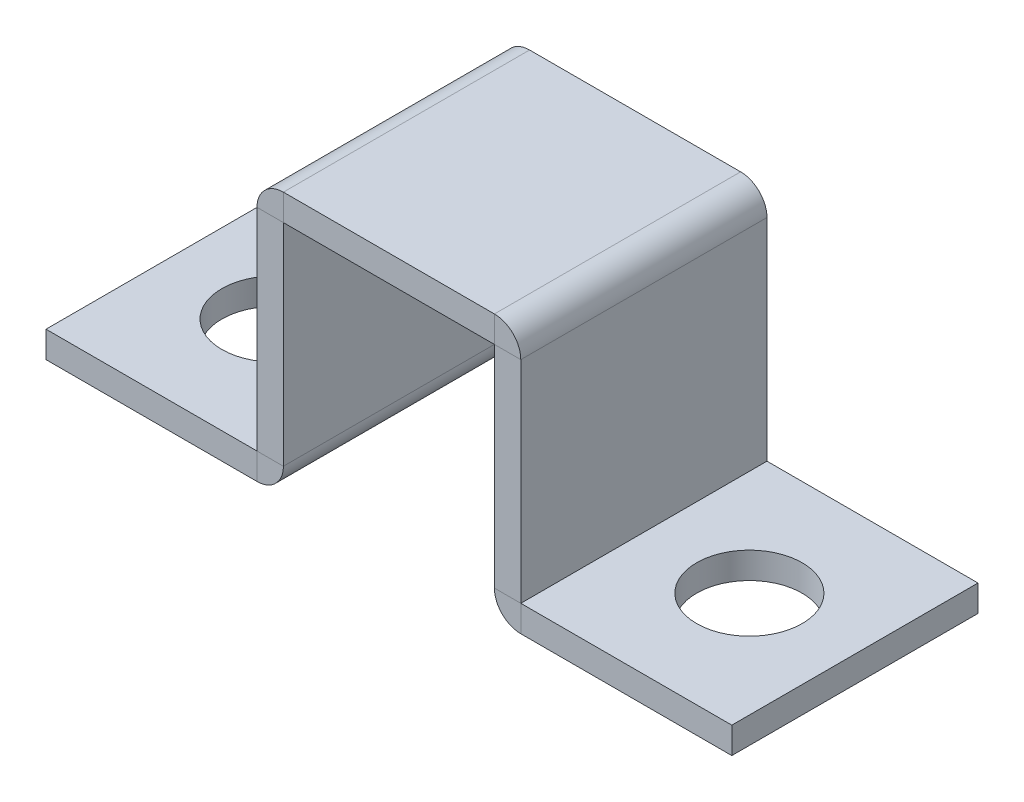
ISO-10303-21;
HEADER;
FILE_DESCRIPTION(('STEP AP214'),'2;1');
FILE_NAME('part.step','',(''),(''),'','','');
FILE_SCHEMA(('AUTOMOTIVE_DESIGN { 1 0 10303 214 1 1 1 1 }'));
ENDSEC;
DATA;
#1=APPLICATION_CONTEXT('core data for automotive mechanical design processes');
#2=APPLICATION_PROTOCOL_DEFINITION('international standard','automotive_design',2000,#1);
#3=PRODUCT_CONTEXT('',#1,'mechanical');
#4=PRODUCT('Part','Part','',(#3));
#5=PRODUCT_RELATED_PRODUCT_CATEGORY('part','',(#4));
#6=PRODUCT_DEFINITION_FORMATION('','',#4);
#7=PRODUCT_DEFINITION_CONTEXT('part definition',#1,'design');
#8=PRODUCT_DEFINITION('design','',#6,#7);
#9=PRODUCT_DEFINITION_SHAPE('','',#8);
#10=(LENGTH_UNIT() NAMED_UNIT(*) SI_UNIT(.MILLI.,.METRE.));
#11=(NAMED_UNIT(*) PLANE_ANGLE_UNIT() SI_UNIT($,.RADIAN.));
#12=(NAMED_UNIT(*) SI_UNIT($,.STERADIAN.) SOLID_ANGLE_UNIT());
#13=UNCERTAINTY_MEASURE_WITH_UNIT(LENGTH_MEASURE(1.E-05),#10,'distance_accuracy_value','');
#14=(GEOMETRIC_REPRESENTATION_CONTEXT(3) GLOBAL_UNCERTAINTY_ASSIGNED_CONTEXT((#13)) GLOBAL_UNIT_ASSIGNED_CONTEXT((#10,
#11,#12)) REPRESENTATION_CONTEXT('',''));
#15=CARTESIAN_POINT('',(0.,0.,0.));
#16=DIRECTION('',(0.,0.,1.));
#17=DIRECTION('',(1.,0.,0.));
#18=AXIS2_PLACEMENT_3D('',#15,#16,#17);
#19=CARTESIAN_POINT('',(7.49999999999999,0.,-7.));
#20=DIRECTION('',(0.,0.,-1.));
#21=DIRECTION('',(-1.,0.,0.));
#22=AXIS2_PLACEMENT_3D('',#19,#20,#21);
#23=PLANE('',#22);
#24=DIRECTION('',(0.,-1.,0.));
#25=VECTOR('',#24,1.);
#26=CARTESIAN_POINT('',(7.49999999999999,0.,-7.));
#27=LINE('',#26,#25);
#28=CARTESIAN_POINT('',(7.49999999999999,0.,-7.));
#29=VERTEX_POINT('',#28);
#30=CARTESIAN_POINT('',(7.49999999999999,-1.5,-7.));
#31=VERTEX_POINT('',#30);
#32=EDGE_CURVE('E11',#29,#31,#27,.T.);
#33=ORIENTED_EDGE('',*,*,#32,.F.);
#34=DIRECTION('',(1.,0.,0.));
#35=VECTOR('',#34,1.);
#36=CARTESIAN_POINT('',(7.49999999999999,0.,-7.));
#37=LINE('',#36,#35);
#38=CARTESIAN_POINT('',(19.5,0.,-7.));
#39=VERTEX_POINT('',#38);
#40=EDGE_CURVE('E211',#29,#39,#37,.T.);
#41=ORIENTED_EDGE('',*,*,#40,.T.);
#42=DIRECTION('',(0.,-1.,0.));
#43=VECTOR('',#42,1.);
#44=CARTESIAN_POINT('',(19.5,0.,-7.));
#45=LINE('',#44,#43);
#46=CARTESIAN_POINT('',(19.5,-1.5,-7.));
#47=VERTEX_POINT('',#46);
#48=EDGE_CURVE('E209',#39,#47,#45,.T.);
#49=ORIENTED_EDGE('',*,*,#48,.T.);
#50=DIRECTION('',(1.,0.,0.));
#51=VECTOR('',#50,1.);
#52=CARTESIAN_POINT('',(7.49999999999999,-1.5,-7.));
#53=LINE('',#52,#51);
#54=EDGE_CURVE('E161',#31,#47,#53,.T.);
#55=ORIENTED_EDGE('',*,*,#54,.F.);
#56=EDGE_LOOP('',(#33,#41,#49,#55));
#57=FACE_BOUND('',#56,.T.);
#58=ADVANCED_FACE('F35',(#57),#23,.T.);
#59=CARTESIAN_POINT('',(7.49999999999999,0.,-7.));
#60=DIRECTION('',(0.,0.,-1.));
#61=DIRECTION('',(-1.,0.,0.));
#62=AXIS2_PLACEMENT_3D('',#59,#60,#61);
#63=PLANE('',#62);
#64=DIRECTION('',(-1.,0.,0.));
#65=VECTOR('',#64,1.);
#66=CARTESIAN_POINT('',(7.49999999999999,0.,-7.));
#67=LINE('',#66,#65);
#68=CARTESIAN_POINT('',(5.99999999999999,0.,-7.));
#69=VERTEX_POINT('',#68);
#70=EDGE_CURVE('E43',#29,#69,#67,.T.);
#71=ORIENTED_EDGE('',*,*,#70,.F.);
#72=ORIENTED_EDGE('',*,*,#32,.T.);
#73=CARTESIAN_POINT('',(7.49999999999999,0.,-7.));
#74=DIRECTION('',(0.,0.,1.));
#75=DIRECTION('',(1.,0.,0.));
#76=AXIS2_PLACEMENT_3D('',#73,#74,#75);
#77=CIRCLE('',#76,1.5);
#78=EDGE_CURVE('E276',#31,#69,#77,.F.);
#79=ORIENTED_EDGE('',*,*,#78,.T.);
#80=EDGE_LOOP('',(#71,#72,#79));
#81=FACE_BOUND('',#80,.T.);
#82=ADVANCED_FACE('F327',(#81),#63,.T.);
#83=CARTESIAN_POINT('',(7.49999999999999,0.,7.));
#84=DIRECTION('',(0.,0.,1.));
#85=DIRECTION('',(1.,0.,0.));
#86=AXIS2_PLACEMENT_3D('',#83,#84,#85);
#87=PLANE('',#86);
#88=DIRECTION('',(-1.,0.,0.));
#89=VECTOR('',#88,1.);
#90=CARTESIAN_POINT('',(7.49999999999999,0.,7.));
#91=LINE('',#90,#89);
#92=CARTESIAN_POINT('',(7.49999999999999,0.,7.));
#93=VERTEX_POINT('',#92);
#94=CARTESIAN_POINT('',(5.99999999999999,0.,7.));
#95=VERTEX_POINT('',#94);
#96=EDGE_CURVE('E50',#93,#95,#91,.T.);
#97=ORIENTED_EDGE('',*,*,#96,.F.);
#98=DIRECTION('',(0.,-1.,0.));
#99=VECTOR('',#98,1.);
#100=CARTESIAN_POINT('',(7.5,13.5,7.));
#101=LINE('',#100,#99);
#102=CARTESIAN_POINT('',(7.5,12.,7.));
#103=VERTEX_POINT('',#102);
#104=EDGE_CURVE('E171',#103,#93,#101,.T.);
#105=ORIENTED_EDGE('',*,*,#104,.F.);
#106=DIRECTION('',(1.,0.,0.));
#107=VECTOR('',#106,1.);
#108=CARTESIAN_POINT('',(6.,12.,7.));
#109=LINE('',#108,#107);
#110=CARTESIAN_POINT('',(6.,12.,7.));
#111=VERTEX_POINT('',#110);
#112=EDGE_CURVE('E308',#111,#103,#109,.T.);
#113=ORIENTED_EDGE('',*,*,#112,.F.);
#114=DIRECTION('',(0.,-1.,0.));
#115=VECTOR('',#114,1.);
#116=CARTESIAN_POINT('',(6.,13.5,7.));
#117=LINE('',#116,#115);
#118=EDGE_CURVE('E204',#111,#95,#117,.T.);
#119=ORIENTED_EDGE('',*,*,#118,.T.);
#120=EDGE_LOOP('',(#97,#105,#113,#119));
#121=FACE_BOUND('',#120,.T.);
#122=ADVANCED_FACE('F346',(#121),#87,.T.);
#123=CARTESIAN_POINT('',(7.49999999999999,0.,7.));
#124=DIRECTION('',(0.,0.,1.));
#125=DIRECTION('',(1.,0.,0.));
#126=AXIS2_PLACEMENT_3D('',#123,#124,#125);
#127=PLANE('',#126);
#128=DIRECTION('',(0.,-1.,0.));
#129=VECTOR('',#128,1.);
#130=CARTESIAN_POINT('',(7.49999999999999,0.,7.));
#131=LINE('',#130,#129);
#132=CARTESIAN_POINT('',(7.49999999999999,-1.5,7.));
#133=VERTEX_POINT('',#132);
#134=EDGE_CURVE('E57',#93,#133,#131,.T.);
#135=ORIENTED_EDGE('',*,*,#134,.F.);
#136=ORIENTED_EDGE('',*,*,#96,.T.);
#137=CARTESIAN_POINT('',(7.49999999999999,0.,7.));
#138=DIRECTION('',(0.,0.,1.));
#139=DIRECTION('',(1.,0.,0.));
#140=AXIS2_PLACEMENT_3D('',#137,#138,#139);
#141=CIRCLE('',#140,1.5);
#142=EDGE_CURVE('E285',#95,#133,#141,.T.);
#143=ORIENTED_EDGE('',*,*,#142,.T.);
#144=EDGE_LOOP('',(#135,#136,#143));
#145=FACE_BOUND('',#144,.T.);
#146=ADVANCED_FACE('F336',(#145),#127,.T.);
#147=CARTESIAN_POINT('',(-6.,12.,7.));
#148=DIRECTION('',(0.,0.,1.));
#149=DIRECTION('',(1.,0.,0.));
#150=AXIS2_PLACEMENT_3D('',#147,#148,#149);
#151=PLANE('',#150);
#152=DIRECTION('',(0.,1.,0.));
#153=VECTOR('',#152,1.);
#154=CARTESIAN_POINT('',(-6.,12.,7.));
#155=LINE('',#154,#153);
#156=CARTESIAN_POINT('',(-6.,12.,7.));
#157=VERTEX_POINT('',#156);
#158=CARTESIAN_POINT('',(-6.,13.5,7.));
#159=VERTEX_POINT('',#158);
#160=EDGE_CURVE('E316',#157,#159,#155,.T.);
#161=ORIENTED_EDGE('',*,*,#160,.F.);
#162=DIRECTION('',(1.,0.,0.));
#163=VECTOR('',#162,1.);
#164=CARTESIAN_POINT('',(-7.5,12.,7.));
#165=LINE('',#164,#163);
#166=EDGE_CURVE('E201',#157,#111,#165,.T.);
#167=ORIENTED_EDGE('',*,*,#166,.T.);
#168=DIRECTION('',(0.,1.,0.));
#169=VECTOR('',#168,1.);
#170=CARTESIAN_POINT('',(6.,12.,7.));
#171=LINE('',#170,#169);
#172=CARTESIAN_POINT('',(6.,13.5,7.));
#173=VERTEX_POINT('',#172);
#174=EDGE_CURVE('E306',#111,#173,#171,.T.);
#175=ORIENTED_EDGE('',*,*,#174,.T.);
#176=DIRECTION('',(1.,0.,0.));
#177=VECTOR('',#176,1.);
#178=CARTESIAN_POINT('',(-7.5,13.5,7.));
#179=LINE('',#178,#177);
#180=EDGE_CURVE('E180',#159,#173,#179,.T.);
#181=ORIENTED_EDGE('',*,*,#180,.F.);
#182=EDGE_LOOP('',(#161,#167,#175,#181));
#183=FACE_BOUND('',#182,.T.);
#184=ADVANCED_FACE('F361',(#183),#151,.T.);
#185=CARTESIAN_POINT('',(-6.,12.,7.));
#186=DIRECTION('',(0.,0.,1.));
#187=DIRECTION('',(1.,0.,0.));
#188=AXIS2_PLACEMENT_3D('',#185,#186,#187);
#189=PLANE('',#188);
#190=DIRECTION('',(-1.,0.,0.));
#191=VECTOR('',#190,1.);
#192=CARTESIAN_POINT('',(-6.,12.,7.));
#193=LINE('',#192,#191);
#194=CARTESIAN_POINT('',(-7.5,12.,7.));
#195=VERTEX_POINT('',#194);
#196=EDGE_CURVE('E314',#157,#195,#193,.T.);
#197=ORIENTED_EDGE('',*,*,#196,.F.);
#198=ORIENTED_EDGE('',*,*,#160,.T.);
#199=CARTESIAN_POINT('',(-6.,12.,7.));
#200=DIRECTION('',(0.,0.,1.));
#201=DIRECTION('',(1.,0.,0.));
#202=AXIS2_PLACEMENT_3D('',#199,#200,#201);
#203=CIRCLE('',#202,1.5);
#204=EDGE_CURVE('E183',#195,#159,#203,.F.);
#205=ORIENTED_EDGE('',*,*,#204,.F.);
#206=EDGE_LOOP('',(#197,#198,#205));
#207=FACE_BOUND('',#206,.T.);
#208=ADVANCED_FACE('F369',(#207),#189,.T.);
#209=CARTESIAN_POINT('',(-6.,12.,-7.));
#210=DIRECTION('',(0.,0.,-1.));
#211=DIRECTION('',(-1.,0.,0.));
#212=AXIS2_PLACEMENT_3D('',#209,#210,#211);
#213=PLANE('',#212);
#214=DIRECTION('',(-1.,0.,0.));
#215=VECTOR('',#214,1.);
#216=CARTESIAN_POINT('',(-6.,12.,-7.));
#217=LINE('',#216,#215);
#218=CARTESIAN_POINT('',(-6.,12.,-7.));
#219=VERTEX_POINT('',#218);
#220=CARTESIAN_POINT('',(-7.5,12.,-7.));
#221=VERTEX_POINT('',#220);
#222=EDGE_CURVE('E312',#219,#221,#217,.T.);
#223=ORIENTED_EDGE('',*,*,#222,.F.);
#224=DIRECTION('',(0.,1.,0.));
#225=VECTOR('',#224,1.);
#226=CARTESIAN_POINT('',(-6.00000000000001,0.,-7.));
#227=LINE('',#226,#225);
#228=CARTESIAN_POINT('',(-6.00000000000001,0.,-7.));
#229=VERTEX_POINT('',#228);
#230=EDGE_CURVE('E238',#229,#219,#227,.T.);
#231=ORIENTED_EDGE('',*,*,#230,.F.);
#232=DIRECTION('',(1.,0.,0.));
#233=VECTOR('',#232,1.);
#234=CARTESIAN_POINT('',(-7.50000000000001,0.,-7.));
#235=LINE('',#234,#233);
#236=CARTESIAN_POINT('',(-7.50000000000001,0.,-7.));
#237=VERTEX_POINT('',#236);
#238=EDGE_CURVE('E300',#237,#229,#235,.T.);
#239=ORIENTED_EDGE('',*,*,#238,.F.);
#240=DIRECTION('',(0.,1.,0.));
#241=VECTOR('',#240,1.);
#242=CARTESIAN_POINT('',(-7.50000000000001,0.,-7.));
#243=LINE('',#242,#241);
#244=EDGE_CURVE('E226',#237,#221,#243,.T.);
#245=ORIENTED_EDGE('',*,*,#244,.T.);
#246=EDGE_LOOP('',(#223,#231,#239,#245));
#247=FACE_BOUND('',#246,.T.);
#248=ADVANCED_FACE('F440',(#247),#213,.T.);
#249=CARTESIAN_POINT('',(-6.,12.,-7.));
#250=DIRECTION('',(0.,0.,-1.));
#251=DIRECTION('',(-1.,0.,0.));
#252=AXIS2_PLACEMENT_3D('',#249,#250,#251);
#253=PLANE('',#252);
#254=DIRECTION('',(0.,1.,0.));
#255=VECTOR('',#254,1.);
#256=CARTESIAN_POINT('',(-6.,12.,-7.));
#257=LINE('',#256,#255);
#258=CARTESIAN_POINT('',(-6.,13.5,-7.));
#259=VERTEX_POINT('',#258);
#260=EDGE_CURVE('E310',#219,#259,#257,.T.);
#261=ORIENTED_EDGE('',*,*,#260,.F.);
#262=ORIENTED_EDGE('',*,*,#222,.T.);
#263=CARTESIAN_POINT('',(-6.,12.,-7.));
#264=DIRECTION('',(0.,0.,1.));
#265=DIRECTION('',(1.,0.,0.));
#266=AXIS2_PLACEMENT_3D('',#263,#264,#265);
#267=CIRCLE('',#266,1.5);
#268=EDGE_CURVE('E223',#221,#259,#267,.F.);
#269=ORIENTED_EDGE('',*,*,#268,.T.);
#270=EDGE_LOOP('',(#261,#262,#269));
#271=FACE_BOUND('',#270,.T.);
#272=ADVANCED_FACE('F443',(#271),#253,.T.);
#273=CARTESIAN_POINT('',(6.,12.,7.));
#274=DIRECTION('',(0.,0.,1.));
#275=DIRECTION('',(1.,0.,0.));
#276=AXIS2_PLACEMENT_3D('',#273,#274,#275);
#277=PLANE('',#276);
#278=DIRECTION('',(1.,0.,0.));
#279=VECTOR('',#278,1.);
#280=CARTESIAN_POINT('',(7.49999999999999,0.,7.));
#281=LINE('',#280,#279);
#282=CARTESIAN_POINT('',(19.5,0.,7.));
#283=VERTEX_POINT('',#282);
#284=EDGE_CURVE('E169',#93,#283,#281,.T.);
#285=ORIENTED_EDGE('',*,*,#284,.F.);
#286=ORIENTED_EDGE('',*,*,#134,.T.);
#287=DIRECTION('',(1.,0.,0.));
#288=VECTOR('',#287,1.);
#289=CARTESIAN_POINT('',(7.49999999999999,-1.5,7.));
#290=LINE('',#289,#288);
#291=CARTESIAN_POINT('',(19.5,-1.5,7.));
#292=VERTEX_POINT('',#291);
#293=EDGE_CURVE('E146',#133,#292,#290,.T.);
#294=ORIENTED_EDGE('',*,*,#293,.T.);
#295=DIRECTION('',(0.,-1.,0.));
#296=VECTOR('',#295,1.);
#297=CARTESIAN_POINT('',(19.5,0.,7.));
#298=LINE('',#297,#296);
#299=EDGE_CURVE('E150',#283,#292,#298,.T.);
#300=ORIENTED_EDGE('',*,*,#299,.F.);
#301=EDGE_LOOP('',(#285,#286,#294,#300));
#302=FACE_BOUND('',#301,.T.);
#303=ADVANCED_FACE('F148',(#302),#277,.T.);
#304=CARTESIAN_POINT('',(6.,12.,7.));
#305=DIRECTION('',(0.,0.,1.));
#306=DIRECTION('',(1.,0.,0.));
#307=AXIS2_PLACEMENT_3D('',#304,#305,#306);
#308=PLANE('',#307);
#309=ORIENTED_EDGE('',*,*,#174,.F.);
#310=ORIENTED_EDGE('',*,*,#112,.T.);
#311=CARTESIAN_POINT('',(6.,12.,7.));
#312=DIRECTION('',(0.,0.,1.));
#313=DIRECTION('',(1.,0.,0.));
#314=AXIS2_PLACEMENT_3D('',#311,#312,#313);
#315=CIRCLE('',#314,1.5);
#316=EDGE_CURVE('E177',#173,#103,#315,.F.);
#317=ORIENTED_EDGE('',*,*,#316,.F.);
#318=EDGE_LOOP('',(#309,#310,#317));
#319=FACE_BOUND('',#318,.T.);
#320=ADVANCED_FACE('F354',(#319),#308,.T.);
#321=CARTESIAN_POINT('',(6.,12.,-7.));
#322=DIRECTION('',(0.,0.,-1.));
#323=DIRECTION('',(-1.,0.,0.));
#324=AXIS2_PLACEMENT_3D('',#321,#322,#323);
#325=PLANE('',#324);
#326=DIRECTION('',(0.,1.,0.));
#327=VECTOR('',#326,1.);
#328=CARTESIAN_POINT('',(6.,12.,-7.));
#329=LINE('',#328,#327);
#330=CARTESIAN_POINT('',(6.,12.,-7.));
#331=VERTEX_POINT('',#330);
#332=CARTESIAN_POINT('',(6.,13.5,-7.));
#333=VERTEX_POINT('',#332);
#334=EDGE_CURVE('E304',#331,#333,#329,.T.);
#335=ORIENTED_EDGE('',*,*,#334,.F.);
#336=DIRECTION('',(1.,0.,0.));
#337=VECTOR('',#336,1.);
#338=CARTESIAN_POINT('',(-7.5,12.,-7.));
#339=LINE('',#338,#337);
#340=EDGE_CURVE('E241',#219,#331,#339,.T.);
#341=ORIENTED_EDGE('',*,*,#340,.F.);
#342=ORIENTED_EDGE('',*,*,#260,.T.);
#343=DIRECTION('',(1.,0.,0.));
#344=VECTOR('',#343,1.);
#345=CARTESIAN_POINT('',(-7.5,13.5,-7.));
#346=LINE('',#345,#344);
#347=EDGE_CURVE('E220',#259,#333,#346,.T.);
#348=ORIENTED_EDGE('',*,*,#347,.T.);
#349=EDGE_LOOP('',(#335,#341,#342,#348));
#350=FACE_BOUND('',#349,.T.);
#351=ADVANCED_FACE('F410',(#350),#325,.T.);
#352=CARTESIAN_POINT('',(6.,12.,-7.));
#353=DIRECTION('',(0.,0.,-1.));
#354=DIRECTION('',(-1.,0.,0.));
#355=AXIS2_PLACEMENT_3D('',#352,#353,#354);
#356=PLANE('',#355);
#357=DIRECTION('',(1.,0.,0.));
#358=VECTOR('',#357,1.);
#359=CARTESIAN_POINT('',(6.,12.,-7.));
#360=LINE('',#359,#358);
#361=CARTESIAN_POINT('',(7.5,12.,-7.));
#362=VERTEX_POINT('',#361);
#363=EDGE_CURVE('E302',#331,#362,#360,.T.);
#364=ORIENTED_EDGE('',*,*,#363,.F.);
#365=ORIENTED_EDGE('',*,*,#334,.T.);
#366=CARTESIAN_POINT('',(6.,12.,-7.));
#367=DIRECTION('',(0.,0.,1.));
#368=DIRECTION('',(1.,0.,0.));
#369=AXIS2_PLACEMENT_3D('',#366,#367,#368);
#370=CIRCLE('',#369,1.5);
#371=EDGE_CURVE('E217',#333,#362,#370,.F.);
#372=ORIENTED_EDGE('',*,*,#371,.T.);
#373=EDGE_LOOP('',(#364,#365,#372));
#374=FACE_BOUND('',#373,.T.);
#375=ADVANCED_FACE('F414',(#374),#356,.T.);
#376=CARTESIAN_POINT('',(-7.50000000000001,0.,-7.));
#377=DIRECTION('',(0.,0.,-1.));
#378=DIRECTION('',(-1.,0.,0.));
#379=AXIS2_PLACEMENT_3D('',#376,#377,#378);
#380=PLANE('',#379);
#381=DIRECTION('',(0.,-1.,0.));
#382=VECTOR('',#381,1.);
#383=CARTESIAN_POINT('',(6.,13.5,-7.));
#384=LINE('',#383,#382);
#385=EDGE_CURVE('E155',#331,#69,#384,.T.);
#386=ORIENTED_EDGE('',*,*,#385,.F.);
#387=ORIENTED_EDGE('',*,*,#363,.T.);
#388=DIRECTION('',(0.,-1.,0.));
#389=VECTOR('',#388,1.);
#390=CARTESIAN_POINT('',(7.5,13.5,-7.));
#391=LINE('',#390,#389);
#392=EDGE_CURVE('E214',#362,#29,#391,.T.);
#393=ORIENTED_EDGE('',*,*,#392,.T.);
#394=ORIENTED_EDGE('',*,*,#70,.T.);
#395=EDGE_LOOP('',(#386,#387,#393,#394));
#396=FACE_BOUND('',#395,.T.);
#397=ADVANCED_FACE('F323',(#396),#380,.T.);
#398=CARTESIAN_POINT('',(-7.50000000000001,0.,-7.));
#399=DIRECTION('',(0.,0.,-1.));
#400=DIRECTION('',(-1.,0.,0.));
#401=AXIS2_PLACEMENT_3D('',#398,#399,#400);
#402=PLANE('',#401);
#403=DIRECTION('',(0.,-1.,0.));
#404=VECTOR('',#403,1.);
#405=CARTESIAN_POINT('',(-7.50000000000001,0.,-7.));
#406=LINE('',#405,#404);
#407=CARTESIAN_POINT('',(-7.50000000000001,-1.5,-7.));
#408=VERTEX_POINT('',#407);
#409=EDGE_CURVE('E298',#237,#408,#406,.T.);
#410=ORIENTED_EDGE('',*,*,#409,.F.);
#411=ORIENTED_EDGE('',*,*,#238,.T.);
#412=CARTESIAN_POINT('',(-7.50000000000001,0.,-7.));
#413=DIRECTION('',(0.,0.,1.));
#414=DIRECTION('',(1.,0.,0.));
#415=AXIS2_PLACEMENT_3D('',#412,#413,#414);
#416=CIRCLE('',#415,1.5);
#417=EDGE_CURVE('E279',#229,#408,#416,.F.);
#418=ORIENTED_EDGE('',*,*,#417,.T.);
#419=EDGE_LOOP('',(#410,#411,#418));
#420=FACE_BOUND('',#419,.T.);
#421=ADVANCED_FACE('F421',(#420),#402,.T.);
#422=CARTESIAN_POINT('',(-7.50000000000001,0.,7.));
#423=DIRECTION('',(0.,0.,1.));
#424=DIRECTION('',(1.,0.,0.));
#425=AXIS2_PLACEMENT_3D('',#422,#423,#424);
#426=PLANE('',#425);
#427=DIRECTION('',(0.,-1.,0.));
#428=VECTOR('',#427,1.);
#429=CARTESIAN_POINT('',(-7.50000000000001,0.,7.));
#430=LINE('',#429,#428);
#431=CARTESIAN_POINT('',(-7.50000000000001,0.,7.));
#432=VERTEX_POINT('',#431);
#433=CARTESIAN_POINT('',(-7.50000000000001,-1.5,7.));
#434=VERTEX_POINT('',#433);
#435=EDGE_CURVE('E296',#432,#434,#430,.T.);
#436=ORIENTED_EDGE('',*,*,#435,.F.);
#437=DIRECTION('',(1.,0.,0.));
#438=VECTOR('',#437,1.);
#439=CARTESIAN_POINT('',(-19.5,0.,7.));
#440=LINE('',#439,#438);
#441=CARTESIAN_POINT('',(-19.5,0.,7.));
#442=VERTEX_POINT('',#441);
#443=EDGE_CURVE('E189',#442,#432,#440,.T.);
#444=ORIENTED_EDGE('',*,*,#443,.F.);
#445=DIRECTION('',(0.,1.,0.));
#446=VECTOR('',#445,1.);
#447=CARTESIAN_POINT('',(-19.5,-1.5,7.));
#448=LINE('',#447,#446);
#449=CARTESIAN_POINT('',(-19.5,-1.5,7.));
#450=VERTEX_POINT('',#449);
#451=EDGE_CURVE('E192',#450,#442,#448,.T.);
#452=ORIENTED_EDGE('',*,*,#451,.F.);
#453=DIRECTION('',(1.,0.,0.));
#454=VECTOR('',#453,1.);
#455=CARTESIAN_POINT('',(-19.5,-1.5,7.));
#456=LINE('',#455,#454);
#457=EDGE_CURVE('E195',#450,#434,#456,.T.);
#458=ORIENTED_EDGE('',*,*,#457,.T.);
#459=EDGE_LOOP('',(#436,#444,#452,#458));
#460=FACE_BOUND('',#459,.T.);
#461=ADVANCED_FACE('F384',(#460),#426,.T.);
#462=CARTESIAN_POINT('',(-7.50000000000001,0.,7.));
#463=DIRECTION('',(0.,0.,1.));
#464=DIRECTION('',(1.,0.,0.));
#465=AXIS2_PLACEMENT_3D('',#462,#463,#464);
#466=PLANE('',#465);
#467=DIRECTION('',(1.,0.,0.));
#468=VECTOR('',#467,1.);
#469=CARTESIAN_POINT('',(-7.50000000000001,0.,7.));
#470=LINE('',#469,#468);
#471=CARTESIAN_POINT('',(-6.00000000000001,0.,7.));
#472=VERTEX_POINT('',#471);
#473=EDGE_CURVE('E294',#432,#472,#470,.T.);
#474=ORIENTED_EDGE('',*,*,#473,.F.);
#475=ORIENTED_EDGE('',*,*,#435,.T.);
#476=CARTESIAN_POINT('',(-7.50000000000001,0.,7.));
#477=DIRECTION('',(0.,0.,1.));
#478=DIRECTION('',(1.,0.,0.));
#479=AXIS2_PLACEMENT_3D('',#476,#477,#478);
#480=CIRCLE('',#479,1.5);
#481=EDGE_CURVE('E287',#434,#472,#480,.T.);
#482=ORIENTED_EDGE('',*,*,#481,.T.);
#483=EDGE_LOOP('',(#474,#475,#482));
#484=FACE_BOUND('',#483,.T.);
#485=ADVANCED_FACE('F400',(#484),#466,.T.);
#486=CARTESIAN_POINT('',(7.49999999999999,-1.5,7.));
#487=DIRECTION('',(0.,1.,0.));
#488=DIRECTION('',(0.,0.,1.));
#489=AXIS2_PLACEMENT_3D('',#486,#487,#488);
#490=PLANE('',#489);
#491=CARTESIAN_POINT('',(13.5,-1.5,0.));
#492=DIRECTION('',(0.,1.,0.));
#493=DIRECTION('',(0.,0.,1.));
#494=AXIS2_PLACEMENT_3D('',#491,#492,#493);
#495=CIRCLE('',#494,3.);
#496=CARTESIAN_POINT('',(13.5,-1.5,3.));
#497=VERTEX_POINT('',#496);
#498=EDGE_CURVE('E698',#497,#497,#495,.T.);
#499=ORIENTED_EDGE('',*,*,#498,.T.);
#500=EDGE_LOOP('',(#499));
#501=FACE_BOUND('',#500,.T.);
#502=ORIENTED_EDGE('',*,*,#293,.F.);
#503=DIRECTION('',(0.,0.,-1.));
#504=VECTOR('',#503,1.);
#505=CARTESIAN_POINT('',(7.49999999999999,-1.5,7.));
#506=LINE('',#505,#504);
#507=EDGE_CURVE('E290',#133,#31,#506,.T.);
#508=ORIENTED_EDGE('',*,*,#507,.T.);
#509=ORIENTED_EDGE('',*,*,#54,.T.);
#510=DIRECTION('',(0.,0.,-1.));
#511=VECTOR('',#510,1.);
#512=CARTESIAN_POINT('',(19.5,-1.5,7.));
#513=LINE('',#512,#511);
#514=EDGE_CURVE('E158',#292,#47,#513,.T.);
#515=ORIENTED_EDGE('',*,*,#514,.F.);
#516=EDGE_LOOP('',(#502,#508,#509,#515));
#517=FACE_BOUND('',#516,.T.);
#518=ADVANCED_FACE('F159',(#501,#517),#490,.F.);
#519=CARTESIAN_POINT('',(19.5,0.,7.));
#520=DIRECTION('',(1.,0.,0.));
#521=DIRECTION('',(0.,0.,-1.));
#522=AXIS2_PLACEMENT_3D('',#519,#520,#521);
#523=PLANE('',#522);
#524=ORIENTED_EDGE('',*,*,#48,.F.);
#525=DIRECTION('',(0.,0.,-1.));
#526=VECTOR('',#525,1.);
#527=CARTESIAN_POINT('',(19.5,0.,7.));
#528=LINE('',#527,#526);
#529=EDGE_CURVE('E166',#283,#39,#528,.T.);
#530=ORIENTED_EDGE('',*,*,#529,.F.);
#531=ORIENTED_EDGE('',*,*,#299,.T.);
#532=ORIENTED_EDGE('',*,*,#514,.T.);
#533=EDGE_LOOP('',(#524,#530,#531,#532));
#534=FACE_BOUND('',#533,.T.);
#535=ADVANCED_FACE('F168',(#534),#523,.T.);
#536=CARTESIAN_POINT('',(7.49999999999999,0.,7.));
#537=DIRECTION('',(0.,1.,0.));
#538=DIRECTION('',(0.,0.,1.));
#539=AXIS2_PLACEMENT_3D('',#536,#537,#538);
#540=PLANE('',#539);
#541=CARTESIAN_POINT('',(13.5,0.,0.));
#542=DIRECTION('',(0.,1.,0.));
#543=DIRECTION('',(0.,0.,1.));
#544=AXIS2_PLACEMENT_3D('',#541,#542,#543);
#545=CIRCLE('',#544,3.);
#546=CARTESIAN_POINT('',(13.5,0.,3.));
#547=VERTEX_POINT('',#546);
#548=EDGE_CURVE('E695',#547,#547,#545,.T.);
#549=ORIENTED_EDGE('',*,*,#548,.F.);
#550=EDGE_LOOP('',(#549));
#551=FACE_BOUND('',#550,.T.);
#552=ORIENTED_EDGE('',*,*,#40,.F.);
#553=DIRECTION('',(0.,0.,-1.));
#554=VECTOR('',#553,1.);
#555=CARTESIAN_POINT('',(7.49999999999999,0.,7.));
#556=LINE('',#555,#554);
#557=EDGE_CURVE('E270',#93,#29,#556,.T.);
#558=ORIENTED_EDGE('',*,*,#557,.F.);
#559=ORIENTED_EDGE('',*,*,#284,.T.);
#560=ORIENTED_EDGE('',*,*,#529,.T.);
#561=EDGE_LOOP('',(#552,#558,#559,#560));
#562=FACE_BOUND('',#561,.T.);
#563=ADVANCED_FACE('F340',(#551,#562),#540,.T.);
#564=CARTESIAN_POINT('',(7.5,13.5,7.));
#565=DIRECTION('',(1.,0.,0.));
#566=DIRECTION('',(0.,1.,0.));
#567=AXIS2_PLACEMENT_3D('',#564,#565,#566);
#568=PLANE('',#567);
#569=ORIENTED_EDGE('',*,*,#392,.F.);
#570=DIRECTION('',(0.,0.,-1.));
#571=VECTOR('',#570,1.);
#572=CARTESIAN_POINT('',(7.5,12.,7.));
#573=LINE('',#572,#571);
#574=EDGE_CURVE('E267',#103,#362,#573,.T.);
#575=ORIENTED_EDGE('',*,*,#574,.F.);
#576=ORIENTED_EDGE('',*,*,#104,.T.);
#577=ORIENTED_EDGE('',*,*,#557,.T.);
#578=EDGE_LOOP('',(#569,#575,#576,#577));
#579=FACE_BOUND('',#578,.T.);
#580=ADVANCED_FACE('F344',(#579),#568,.T.);
#581=CARTESIAN_POINT('',(6.,12.,7.));
#582=DIRECTION('',(0.,0.,-1.));
#583=DIRECTION('',(-1.,0.,0.));
#584=AXIS2_PLACEMENT_3D('',#581,#582,#583);
#585=CYLINDRICAL_SURFACE('',#584,1.5);
#586=ORIENTED_EDGE('',*,*,#371,.F.);
#587=DIRECTION('',(0.,0.,-1.));
#588=VECTOR('',#587,1.);
#589=CARTESIAN_POINT('',(6.,13.5,7.));
#590=LINE('',#589,#588);
#591=EDGE_CURVE('E264',#173,#333,#590,.T.);
#592=ORIENTED_EDGE('',*,*,#591,.F.);
#593=ORIENTED_EDGE('',*,*,#316,.T.);
#594=ORIENTED_EDGE('',*,*,#574,.T.);
#595=EDGE_LOOP('',(#586,#592,#593,#594));
#596=FACE_BOUND('',#595,.T.);
#597=ADVANCED_FACE('F352',(#596),#585,.T.);
#598=CARTESIAN_POINT('',(-7.5,13.5,7.));
#599=DIRECTION('',(0.,1.,0.));
#600=DIRECTION('',(0.,0.,1.));
#601=AXIS2_PLACEMENT_3D('',#598,#599,#600);
#602=PLANE('',#601);
#603=ORIENTED_EDGE('',*,*,#347,.F.);
#604=DIRECTION('',(0.,0.,-1.));
#605=VECTOR('',#604,1.);
#606=CARTESIAN_POINT('',(-6.,13.5,7.));
#607=LINE('',#606,#605);
#608=EDGE_CURVE('E261',#159,#259,#607,.T.);
#609=ORIENTED_EDGE('',*,*,#608,.F.);
#610=ORIENTED_EDGE('',*,*,#180,.T.);
#611=ORIENTED_EDGE('',*,*,#591,.T.);
#612=EDGE_LOOP('',(#603,#609,#610,#611));
#613=FACE_BOUND('',#612,.T.);
#614=ADVANCED_FACE('F359',(#613),#602,.T.);
#615=CARTESIAN_POINT('',(-6.,12.,7.));
#616=DIRECTION('',(0.,0.,-1.));
#617=DIRECTION('',(-1.,0.,0.));
#618=AXIS2_PLACEMENT_3D('',#615,#616,#617);
#619=CYLINDRICAL_SURFACE('',#618,1.5);
#620=ORIENTED_EDGE('',*,*,#268,.F.);
#621=DIRECTION('',(0.,0.,-1.));
#622=VECTOR('',#621,1.);
#623=CARTESIAN_POINT('',(-7.5,12.,7.));
#624=LINE('',#623,#622);
#625=EDGE_CURVE('E258',#195,#221,#624,.T.);
#626=ORIENTED_EDGE('',*,*,#625,.F.);
#627=ORIENTED_EDGE('',*,*,#204,.T.);
#628=ORIENTED_EDGE('',*,*,#608,.T.);
#629=EDGE_LOOP('',(#620,#626,#627,#628));
#630=FACE_BOUND('',#629,.T.);
#631=ADVANCED_FACE('F367',(#630),#619,.T.);
#632=CARTESIAN_POINT('',(-7.50000000000001,0.,7.));
#633=DIRECTION('',(-1.,0.,0.));
#634=DIRECTION('',(0.,-1.,0.));
#635=AXIS2_PLACEMENT_3D('',#632,#633,#634);
#636=PLANE('',#635);
#637=ORIENTED_EDGE('',*,*,#244,.F.);
#638=DIRECTION('',(0.,0.,-1.));
#639=VECTOR('',#638,1.);
#640=CARTESIAN_POINT('',(-7.50000000000001,0.,7.));
#641=LINE('',#640,#639);
#642=EDGE_CURVE('E255',#432,#237,#641,.T.);
#643=ORIENTED_EDGE('',*,*,#642,.F.);
#644=DIRECTION('',(0.,1.,0.));
#645=VECTOR('',#644,1.);
#646=CARTESIAN_POINT('',(-7.50000000000001,0.,7.));
#647=LINE('',#646,#645);
#648=EDGE_CURVE('E186',#432,#195,#647,.T.);
#649=ORIENTED_EDGE('',*,*,#648,.T.);
#650=ORIENTED_EDGE('',*,*,#625,.T.);
#651=EDGE_LOOP('',(#637,#643,#649,#650));
#652=FACE_BOUND('',#651,.T.);
#653=ADVANCED_FACE('F374',(#652),#636,.T.);
#654=CARTESIAN_POINT('',(-19.5,0.,7.));
#655=DIRECTION('',(0.,1.,0.));
#656=DIRECTION('',(0.,0.,1.));
#657=AXIS2_PLACEMENT_3D('',#654,#655,#656);
#658=PLANE('',#657);
#659=CARTESIAN_POINT('',(-13.5,0.,0.));
#660=DIRECTION('',(0.,1.,0.));
#661=DIRECTION('',(0.,0.,1.));
#662=AXIS2_PLACEMENT_3D('',#659,#660,#661);
#663=CIRCLE('',#662,3.);
#664=CARTESIAN_POINT('',(-13.5,0.,3.));
#665=VERTEX_POINT('',#664);
#666=EDGE_CURVE('E699',#665,#665,#663,.T.);
#667=ORIENTED_EDGE('',*,*,#666,.F.);
#668=EDGE_LOOP('',(#667));
#669=FACE_BOUND('',#668,.T.);
#670=DIRECTION('',(1.,0.,0.));
#671=VECTOR('',#670,1.);
#672=CARTESIAN_POINT('',(-19.5,0.,-7.));
#673=LINE('',#672,#671);
#674=CARTESIAN_POINT('',(-19.5,0.,-7.));
#675=VERTEX_POINT('',#674);
#676=EDGE_CURVE('E229',#675,#237,#673,.T.);
#677=ORIENTED_EDGE('',*,*,#676,.F.);
#678=DIRECTION('',(0.,0.,-1.));
#679=VECTOR('',#678,1.);
#680=CARTESIAN_POINT('',(-19.5,0.,7.));
#681=LINE('',#680,#679);
#682=EDGE_CURVE('E253',#442,#675,#681,.T.);
#683=ORIENTED_EDGE('',*,*,#682,.F.);
#684=ORIENTED_EDGE('',*,*,#443,.T.);
#685=ORIENTED_EDGE('',*,*,#642,.T.);
#686=EDGE_LOOP('',(#677,#683,#684,#685));
#687=FACE_BOUND('',#686,.T.);
#688=ADVANCED_FACE('F381',(#669,#687),#658,.T.);
#689=CARTESIAN_POINT('',(-19.5,-1.5,7.));
#690=DIRECTION('',(-1.,0.,0.));
#691=DIRECTION('',(0.,0.,1.));
#692=AXIS2_PLACEMENT_3D('',#689,#690,#691);
#693=PLANE('',#692);
#694=DIRECTION('',(0.,1.,0.));
#695=VECTOR('',#694,1.);
#696=CARTESIAN_POINT('',(-19.5,-1.5,-7.));
#697=LINE('',#696,#695);
#698=CARTESIAN_POINT('',(-19.5,-1.5,-7.));
#699=VERTEX_POINT('',#698);
#700=EDGE_CURVE('E232',#699,#675,#697,.T.);
#701=ORIENTED_EDGE('',*,*,#700,.F.);
#702=DIRECTION('',(0.,0.,-1.));
#703=VECTOR('',#702,1.);
#704=CARTESIAN_POINT('',(-19.5,-1.5,7.));
#705=LINE('',#704,#703);
#706=EDGE_CURVE('E251',#450,#699,#705,.T.);
#707=ORIENTED_EDGE('',*,*,#706,.F.);
#708=ORIENTED_EDGE('',*,*,#451,.T.);
#709=ORIENTED_EDGE('',*,*,#682,.T.);
#710=EDGE_LOOP('',(#701,#707,#708,#709));
#711=FACE_BOUND('',#710,.T.);
#712=ADVANCED_FACE('F387',(#711),#693,.T.);
#713=CARTESIAN_POINT('',(-19.5,-1.5,7.));
#714=DIRECTION('',(0.,1.,0.));
#715=DIRECTION('',(0.,0.,1.));
#716=AXIS2_PLACEMENT_3D('',#713,#714,#715);
#717=PLANE('',#716);
#718=CARTESIAN_POINT('',(-13.5,-1.5,0.));
#719=DIRECTION('',(0.,1.,0.));
#720=DIRECTION('',(0.,0.,1.));
#721=AXIS2_PLACEMENT_3D('',#718,#719,#720);
#722=CIRCLE('',#721,3.);
#723=CARTESIAN_POINT('',(-13.5,-1.5,3.));
#724=VERTEX_POINT('',#723);
#725=EDGE_CURVE('E38',#724,#724,#722,.T.);
#726=ORIENTED_EDGE('',*,*,#725,.T.);
#727=EDGE_LOOP('',(#726));
#728=FACE_BOUND('',#727,.T.);
#729=DIRECTION('',(1.,0.,0.));
#730=VECTOR('',#729,1.);
#731=CARTESIAN_POINT('',(-19.5,-1.5,-7.));
#732=LINE('',#731,#730);
#733=EDGE_CURVE('E235',#699,#408,#732,.T.);
#734=ORIENTED_EDGE('',*,*,#733,.T.);
#735=DIRECTION('',(0.,0.,-1.));
#736=VECTOR('',#735,1.);
#737=CARTESIAN_POINT('',(-7.50000000000001,-1.5,7.));
#738=LINE('',#737,#736);
#739=EDGE_CURVE('E282',#408,#434,#738,.F.);
#740=ORIENTED_EDGE('',*,*,#739,.T.);
#741=ORIENTED_EDGE('',*,*,#457,.F.);
#742=ORIENTED_EDGE('',*,*,#706,.T.);
#743=EDGE_LOOP('',(#734,#740,#741,#742));
#744=FACE_BOUND('',#743,.T.);
#745=ADVANCED_FACE('F391',(#728,#744),#717,.F.);
#746=CARTESIAN_POINT('',(-6.00000000000001,0.,7.));
#747=DIRECTION('',(-1.,0.,0.));
#748=DIRECTION('',(0.,-1.,0.));
#749=AXIS2_PLACEMENT_3D('',#746,#747,#748);
#750=PLANE('',#749);
#751=DIRECTION('',(0.,1.,0.));
#752=VECTOR('',#751,1.);
#753=CARTESIAN_POINT('',(-6.00000000000001,0.,7.));
#754=LINE('',#753,#752);
#755=EDGE_CURVE('E198',#472,#157,#754,.T.);
#756=ORIENTED_EDGE('',*,*,#755,.F.);
#757=DIRECTION('',(0.,0.,-1.));
#758=VECTOR('',#757,1.);
#759=CARTESIAN_POINT('',(-6.00000000000001,0.,7.));
#760=LINE('',#759,#758);
#761=EDGE_CURVE('E165',#472,#229,#760,.T.);
#762=ORIENTED_EDGE('',*,*,#761,.T.);
#763=ORIENTED_EDGE('',*,*,#230,.T.);
#764=DIRECTION('',(0.,0.,-1.));
#765=VECTOR('',#764,1.);
#766=CARTESIAN_POINT('',(-6.,12.,7.));
#767=LINE('',#766,#765);
#768=EDGE_CURVE('E248',#157,#219,#767,.T.);
#769=ORIENTED_EDGE('',*,*,#768,.F.);
#770=EDGE_LOOP('',(#756,#762,#763,#769));
#771=FACE_BOUND('',#770,.T.);
#772=ADVANCED_FACE('F403',(#771),#750,.F.);
#773=CARTESIAN_POINT('',(-7.5,12.,7.));
#774=DIRECTION('',(0.,1.,0.));
#775=DIRECTION('',(0.,0.,1.));
#776=AXIS2_PLACEMENT_3D('',#773,#774,#775);
#777=PLANE('',#776);
#778=ORIENTED_EDGE('',*,*,#340,.T.);
#779=DIRECTION('',(0.,0.,-1.));
#780=VECTOR('',#779,1.);
#781=CARTESIAN_POINT('',(6.,12.,7.));
#782=LINE('',#781,#780);
#783=EDGE_CURVE('E207',#111,#331,#782,.T.);
#784=ORIENTED_EDGE('',*,*,#783,.F.);
#785=ORIENTED_EDGE('',*,*,#166,.F.);
#786=ORIENTED_EDGE('',*,*,#768,.T.);
#787=EDGE_LOOP('',(#778,#784,#785,#786));
#788=FACE_BOUND('',#787,.T.);
#789=ADVANCED_FACE('F408',(#788),#777,.F.);
#790=CARTESIAN_POINT('',(6.,13.5,7.));
#791=DIRECTION('',(1.,0.,0.));
#792=DIRECTION('',(0.,1.,0.));
#793=AXIS2_PLACEMENT_3D('',#790,#791,#792);
#794=PLANE('',#793);
#795=ORIENTED_EDGE('',*,*,#385,.T.);
#796=DIRECTION('',(0.,0.,-1.));
#797=VECTOR('',#796,1.);
#798=CARTESIAN_POINT('',(5.99999999999999,0.,7.));
#799=LINE('',#798,#797);
#800=EDGE_CURVE('E292',#69,#95,#799,.F.);
#801=ORIENTED_EDGE('',*,*,#800,.T.);
#802=ORIENTED_EDGE('',*,*,#118,.F.);
#803=ORIENTED_EDGE('',*,*,#783,.T.);
#804=EDGE_LOOP('',(#795,#801,#802,#803));
#805=FACE_BOUND('',#804,.T.);
#806=ADVANCED_FACE('F331',(#805),#794,.F.);
#807=CARTESIAN_POINT('',(6.,12.,7.));
#808=DIRECTION('',(0.,0.,1.));
#809=DIRECTION('',(1.,0.,0.));
#810=AXIS2_PLACEMENT_3D('',#807,#808,#809);
#811=PLANE('',#810);
#812=ORIENTED_EDGE('',*,*,#648,.F.);
#813=ORIENTED_EDGE('',*,*,#473,.T.);
#814=ORIENTED_EDGE('',*,*,#755,.T.);
#815=ORIENTED_EDGE('',*,*,#196,.T.);
#816=EDGE_LOOP('',(#812,#813,#814,#815));
#817=FACE_BOUND('',#816,.T.);
#818=ADVANCED_FACE('F376',(#817),#811,.T.);
#819=CARTESIAN_POINT('',(6.,12.,-7.));
#820=DIRECTION('',(0.,0.,1.));
#821=DIRECTION('',(1.,0.,0.));
#822=AXIS2_PLACEMENT_3D('',#819,#820,#821);
#823=PLANE('',#822);
#824=ORIENTED_EDGE('',*,*,#676,.T.);
#825=ORIENTED_EDGE('',*,*,#409,.T.);
#826=ORIENTED_EDGE('',*,*,#733,.F.);
#827=ORIENTED_EDGE('',*,*,#700,.T.);
#828=EDGE_LOOP('',(#824,#825,#826,#827));
#829=FACE_BOUND('',#828,.T.);
#830=ADVANCED_FACE('F607',(#829),#823,.F.);
#831=CARTESIAN_POINT('',(-7.50000000000001,0.,7.));
#832=DIRECTION('',(0.,0.,-1.));
#833=DIRECTION('',(-1.,0.,0.));
#834=AXIS2_PLACEMENT_3D('',#831,#832,#833);
#835=CYLINDRICAL_SURFACE('',#834,1.5);
#836=ORIENTED_EDGE('',*,*,#481,.F.);
#837=ORIENTED_EDGE('',*,*,#739,.F.);
#838=ORIENTED_EDGE('',*,*,#417,.F.);
#839=ORIENTED_EDGE('',*,*,#761,.F.);
#840=EDGE_LOOP('',(#836,#837,#838,#839));
#841=FACE_BOUND('',#840,.T.);
#842=ADVANCED_FACE('F396',(#841),#835,.T.);
#843=CARTESIAN_POINT('',(7.49999999999999,0.,7.));
#844=DIRECTION('',(0.,0.,-1.));
#845=DIRECTION('',(-1.,0.,0.));
#846=AXIS2_PLACEMENT_3D('',#843,#844,#845);
#847=CYLINDRICAL_SURFACE('',#846,1.5);
#848=ORIENTED_EDGE('',*,*,#142,.F.);
#849=ORIENTED_EDGE('',*,*,#800,.F.);
#850=ORIENTED_EDGE('',*,*,#78,.F.);
#851=ORIENTED_EDGE('',*,*,#507,.F.);
#852=EDGE_LOOP('',(#848,#849,#850,#851));
#853=FACE_BOUND('',#852,.T.);
#854=ADVANCED_FACE('F335',(#853),#847,.T.);
#855=CARTESIAN_POINT('',(-13.5,-10.,0.));
#856=DIRECTION('',(0.,1.,0.));
#857=DIRECTION('',(0.,0.,1.));
#858=AXIS2_PLACEMENT_3D('',#855,#856,#857);
#859=CYLINDRICAL_SURFACE('',#858,3.);
#860=ORIENTED_EDGE('',*,*,#666,.T.);
#861=EDGE_LOOP('',(#860));
#862=FACE_BOUND('',#861,.T.);
#863=ORIENTED_EDGE('',*,*,#725,.F.);
#864=EDGE_LOOP('',(#863));
#865=FACE_BOUND('',#864,.T.);
#866=ADVANCED_FACE('F636',(#862,#865),#859,.F.);
#867=CARTESIAN_POINT('',(13.5,-10.,0.));
#868=DIRECTION('',(0.,1.,0.));
#869=DIRECTION('',(0.,0.,1.));
#870=AXIS2_PLACEMENT_3D('',#867,#868,#869);
#871=CYLINDRICAL_SURFACE('',#870,3.);
#872=ORIENTED_EDGE('',*,*,#548,.T.);
#873=EDGE_LOOP('',(#872));
#874=FACE_BOUND('',#873,.T.);
#875=ORIENTED_EDGE('',*,*,#498,.F.);
#876=EDGE_LOOP('',(#875));
#877=FACE_BOUND('',#876,.T.);
#878=ADVANCED_FACE('F678',(#874,#877),#871,.F.);
#879=CLOSED_SHELL('',(#58,#82,#122,#146,#184,#208,#248,#272,#303,#320,#351,#375,#397,#421,#461,
#485,#518,#535,#563,#580,#597,#614,#631,#653,#688,#712,#745,#772,#789,#806,#818,#830,#842,#854,
#866,#878));
#880=MANIFOLD_SOLID_BREP('B2',#879);
#881=ADVANCED_BREP_SHAPE_REPRESENTATION('',(#18,#880),#14);
#882=SHAPE_DEFINITION_REPRESENTATION(#9,#881);
ENDSEC;
END-ISO-10303-21;
